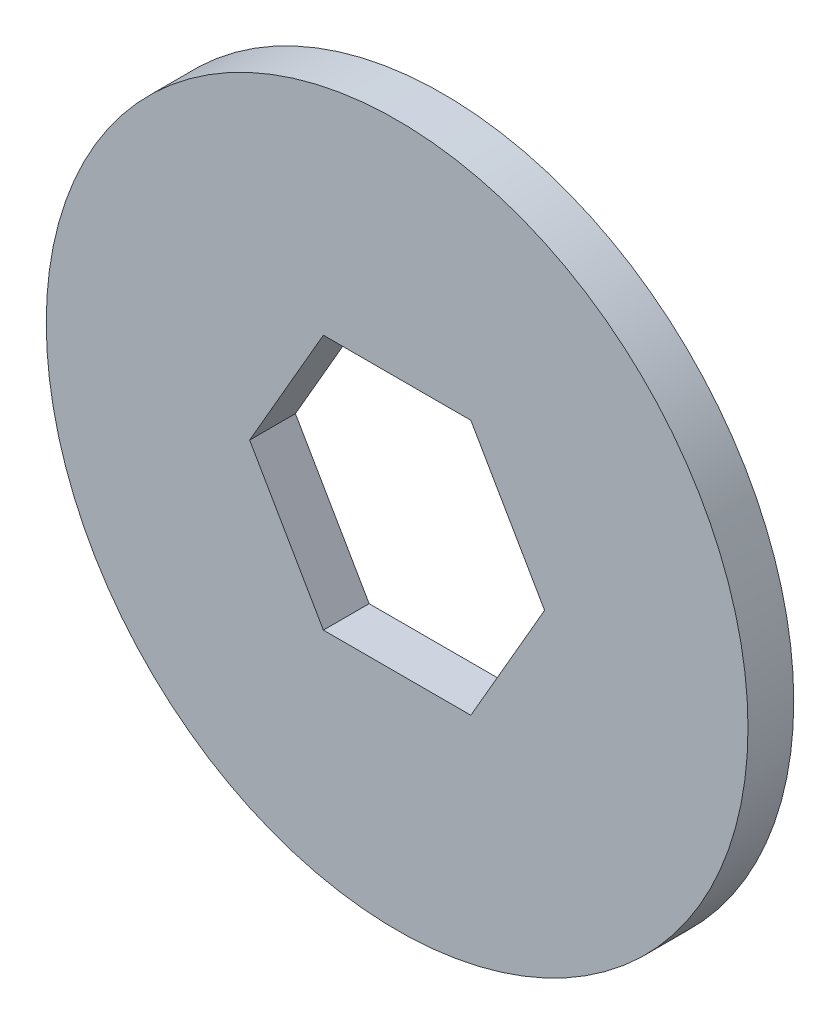
ISO-10303-21;
HEADER;
FILE_DESCRIPTION(('STEP AP214'),'2;1');
FILE_NAME('part.step','',(''),(''),'','','');
FILE_SCHEMA(('AUTOMOTIVE_DESIGN { 1 0 10303 214 1 1 1 1 }'));
ENDSEC;
DATA;
#1=APPLICATION_CONTEXT('core data for automotive mechanical design processes');
#2=APPLICATION_PROTOCOL_DEFINITION('international standard','automotive_design',2000,#1);
#3=PRODUCT_CONTEXT('',#1,'mechanical');
#4=PRODUCT('Part','Part','',(#3));
#5=PRODUCT_RELATED_PRODUCT_CATEGORY('part','',(#4));
#6=PRODUCT_DEFINITION_FORMATION('','',#4);
#7=PRODUCT_DEFINITION_CONTEXT('part definition',#1,'design');
#8=PRODUCT_DEFINITION('design','',#6,#7);
#9=PRODUCT_DEFINITION_SHAPE('','',#8);
#10=(LENGTH_UNIT() NAMED_UNIT(*) SI_UNIT(.MILLI.,.METRE.));
#11=(NAMED_UNIT(*) PLANE_ANGLE_UNIT() SI_UNIT($,.RADIAN.));
#12=(NAMED_UNIT(*) SI_UNIT($,.STERADIAN.) SOLID_ANGLE_UNIT());
#13=UNCERTAINTY_MEASURE_WITH_UNIT(LENGTH_MEASURE(1.E-05),#10,'distance_accuracy_value','');
#14=(GEOMETRIC_REPRESENTATION_CONTEXT(3) GLOBAL_UNCERTAINTY_ASSIGNED_CONTEXT((#13)) GLOBAL_UNIT_ASSIGNED_CONTEXT((#10,
#11,#12)) REPRESENTATION_CONTEXT('',''));
#15=CARTESIAN_POINT('',(0.,0.,0.));
#16=DIRECTION('',(0.,0.,1.));
#17=DIRECTION('',(1.,0.,0.));
#18=AXIS2_PLACEMENT_3D('',#15,#16,#17);
#19=CARTESIAN_POINT('',(0.,0.,2.286));
#20=DIRECTION('',(0.,0.,-1.));
#21=DIRECTION('',(-1.,0.,0.));
#22=AXIS2_PLACEMENT_3D('',#19,#20,#21);
#23=CYLINDRICAL_SURFACE('',#22,17.526);
#24=CARTESIAN_POINT('',(0.,0.,2.286));
#25=DIRECTION('',(0.,0.,1.));
#26=DIRECTION('',(1.,0.,0.));
#27=AXIS2_PLACEMENT_3D('',#24,#25,#26);
#28=CIRCLE('',#27,17.526);
#29=CARTESIAN_POINT('',(17.526,0.,2.286));
#30=VERTEX_POINT('',#29);
#31=EDGE_CURVE('E150',#30,#30,#28,.T.);
#32=ORIENTED_EDGE('',*,*,#31,.F.);
#33=EDGE_LOOP('',(#32));
#34=FACE_BOUND('',#33,.T.);
#35=CARTESIAN_POINT('',(0.,0.,0.));
#36=DIRECTION('',(0.,0.,1.));
#37=DIRECTION('',(1.,0.,0.));
#38=AXIS2_PLACEMENT_3D('',#35,#36,#37);
#39=CIRCLE('',#38,17.526);
#40=CARTESIAN_POINT('',(17.526,0.,0.));
#41=VERTEX_POINT('',#40);
#42=EDGE_CURVE('E135',#41,#41,#39,.T.);
#43=ORIENTED_EDGE('',*,*,#42,.T.);
#44=EDGE_LOOP('',(#43));
#45=FACE_BOUND('',#44,.T.);
#46=ADVANCED_FACE('F45',(#34,#45),#23,.T.);
#47=CARTESIAN_POINT('',(0.,0.,2.286));
#48=DIRECTION('',(0.,0.,1.));
#49=DIRECTION('',(1.,0.,0.));
#50=AXIS2_PLACEMENT_3D('',#47,#48,#49);
#51=PLANE('',#50);
#52=DIRECTION('',(0.5,0.866025403784439,0.));
#53=VECTOR('',#52,1.);
#54=CARTESIAN_POINT('',(-7.366,0.,2.286));
#55=LINE('',#54,#53);
#56=CARTESIAN_POINT('',(-7.366,0.,2.286));
#57=VERTEX_POINT('',#56);
#58=CARTESIAN_POINT('',(-3.683,6.37914312427618,2.286));
#59=VERTEX_POINT('',#58);
#60=EDGE_CURVE('E101',#57,#59,#55,.T.);
#61=ORIENTED_EDGE('',*,*,#60,.T.);
#62=DIRECTION('',(1.,0.,0.));
#63=VECTOR('',#62,1.);
#64=CARTESIAN_POINT('',(-3.683,6.37914312427618,2.286));
#65=LINE('',#64,#63);
#66=CARTESIAN_POINT('',(3.683,6.37914312427618,2.286));
#67=VERTEX_POINT('',#66);
#68=EDGE_CURVE('E109',#59,#67,#65,.T.);
#69=ORIENTED_EDGE('',*,*,#68,.T.);
#70=DIRECTION('',(0.499999999999999,-0.866025403784439,0.));
#71=VECTOR('',#70,1.);
#72=CARTESIAN_POINT('',(3.683,6.37914312427618,2.286));
#73=LINE('',#72,#71);
#74=CARTESIAN_POINT('',(7.366,0.,2.286));
#75=VERTEX_POINT('',#74);
#76=EDGE_CURVE('E60',#67,#75,#73,.T.);
#77=ORIENTED_EDGE('',*,*,#76,.T.);
#78=DIRECTION('',(-0.5,-0.866025403784439,0.));
#79=VECTOR('',#78,1.);
#80=CARTESIAN_POINT('',(7.366,0.,2.286));
#81=LINE('',#80,#79);
#82=CARTESIAN_POINT('',(3.68299999999999,-6.37914312427618,2.286));
#83=VERTEX_POINT('',#82);
#84=EDGE_CURVE('E123',#75,#83,#81,.T.);
#85=ORIENTED_EDGE('',*,*,#84,.T.);
#86=DIRECTION('',(-1.,0.,0.));
#87=VECTOR('',#86,1.);
#88=CARTESIAN_POINT('',(3.68299999999999,-6.37914312427618,2.286));
#89=LINE('',#88,#87);
#90=CARTESIAN_POINT('',(-3.683,-6.37914312427618,2.286));
#91=VERTEX_POINT('',#90);
#92=EDGE_CURVE('E127',#83,#91,#89,.T.);
#93=ORIENTED_EDGE('',*,*,#92,.T.);
#94=DIRECTION('',(-0.5,0.866025403784439,0.));
#95=VECTOR('',#94,1.);
#96=CARTESIAN_POINT('',(-3.683,-6.37914312427618,2.286));
#97=LINE('',#96,#95);
#98=EDGE_CURVE('E106',#91,#57,#97,.T.);
#99=ORIENTED_EDGE('',*,*,#98,.T.);
#100=EDGE_LOOP('',(#61,#69,#77,#85,#93,#99));
#101=FACE_BOUND('',#100,.T.);
#102=ORIENTED_EDGE('',*,*,#31,.T.);
#103=EDGE_LOOP('',(#102));
#104=FACE_BOUND('',#103,.T.);
#105=ADVANCED_FACE('F114',(#101,#104),#51,.T.);
#106=CARTESIAN_POINT('',(0.,0.,0.));
#107=DIRECTION('',(0.,0.,1.));
#108=DIRECTION('',(1.,0.,0.));
#109=AXIS2_PLACEMENT_3D('',#106,#107,#108);
#110=PLANE('',#109);
#111=DIRECTION('',(-1.,0.,0.));
#112=VECTOR('',#111,1.);
#113=CARTESIAN_POINT('',(0.,6.37914312427618,0.));
#114=LINE('',#113,#112);
#115=CARTESIAN_POINT('',(3.683,6.37914312427618,0.));
#116=VERTEX_POINT('',#115);
#117=CARTESIAN_POINT('',(-3.683,6.37914312427618,0.));
#118=VERTEX_POINT('',#117);
#119=EDGE_CURVE('E154',#116,#118,#114,.T.);
#120=ORIENTED_EDGE('',*,*,#119,.T.);
#121=DIRECTION('',(-0.5,-0.866025403784439,0.));
#122=VECTOR('',#121,1.);
#123=CARTESIAN_POINT('',(-5.5245,3.18957156213809,0.));
#124=LINE('',#123,#122);
#125=CARTESIAN_POINT('',(-7.366,0.,0.));
#126=VERTEX_POINT('',#125);
#127=EDGE_CURVE('E11',#118,#126,#124,.T.);
#128=ORIENTED_EDGE('',*,*,#127,.T.);
#129=DIRECTION('',(0.5,-0.866025403784439,0.));
#130=VECTOR('',#129,1.);
#131=CARTESIAN_POINT('',(-5.5245,-3.18957156213809,0.));
#132=LINE('',#131,#130);
#133=CARTESIAN_POINT('',(-3.683,-6.37914312427618,0.));
#134=VERTEX_POINT('',#133);
#135=EDGE_CURVE('E53',#126,#134,#132,.T.);
#136=ORIENTED_EDGE('',*,*,#135,.T.);
#137=DIRECTION('',(1.,0.,0.));
#138=VECTOR('',#137,1.);
#139=CARTESIAN_POINT('',(0.,-6.37914312427618,0.));
#140=LINE('',#139,#138);
#141=CARTESIAN_POINT('',(3.68299999999999,-6.37914312427618,0.));
#142=VERTEX_POINT('',#141);
#143=EDGE_CURVE('E168',#134,#142,#140,.T.);
#144=ORIENTED_EDGE('',*,*,#143,.T.);
#145=DIRECTION('',(0.5,0.866025403784439,0.));
#146=VECTOR('',#145,1.);
#147=CARTESIAN_POINT('',(5.5245,-3.18957156213809,0.));
#148=LINE('',#147,#146);
#149=CARTESIAN_POINT('',(7.366,0.,0.));
#150=VERTEX_POINT('',#149);
#151=EDGE_CURVE('E164',#142,#150,#148,.T.);
#152=ORIENTED_EDGE('',*,*,#151,.T.);
#153=DIRECTION('',(-0.5,0.866025403784439,0.));
#154=VECTOR('',#153,1.);
#155=CARTESIAN_POINT('',(5.5245,3.18957156213808,0.));
#156=LINE('',#155,#154);
#157=EDGE_CURVE('E160',#150,#116,#156,.T.);
#158=ORIENTED_EDGE('',*,*,#157,.T.);
#159=EDGE_LOOP('',(#120,#128,#136,#144,#152,#158));
#160=FACE_BOUND('',#159,.T.);
#161=ORIENTED_EDGE('',*,*,#42,.F.);
#162=EDGE_LOOP('',(#161));
#163=FACE_BOUND('',#162,.T.);
#164=ADVANCED_FACE('F174',(#160,#163),#110,.F.);
#165=CARTESIAN_POINT('',(-7.366,0.,2.286));
#166=DIRECTION('',(-0.866025403784439,0.5,0.));
#167=DIRECTION('',(-0.5,-0.866025403784439,0.));
#168=AXIS2_PLACEMENT_3D('',#165,#166,#167);
#169=PLANE('',#168);
#170=DIRECTION('',(0.,0.,-1.));
#171=VECTOR('',#170,1.);
#172=CARTESIAN_POINT('',(-3.683,6.37914312427618,2.286));
#173=LINE('',#172,#171);
#174=EDGE_CURVE('E68',#59,#118,#173,.T.);
#175=ORIENTED_EDGE('',*,*,#174,.F.);
#176=ORIENTED_EDGE('',*,*,#60,.F.);
#177=DIRECTION('',(0.,0.,-1.));
#178=VECTOR('',#177,1.);
#179=CARTESIAN_POINT('',(-7.366,0.,2.286));
#180=LINE('',#179,#178);
#181=EDGE_CURVE('E132',#57,#126,#180,.T.);
#182=ORIENTED_EDGE('',*,*,#181,.T.);
#183=ORIENTED_EDGE('',*,*,#127,.F.);
#184=EDGE_LOOP('',(#175,#176,#182,#183));
#185=FACE_BOUND('',#184,.T.);
#186=ADVANCED_FACE('F98',(#185),#169,.F.);
#187=CARTESIAN_POINT('',(-3.683,-6.37914312427618,2.286));
#188=DIRECTION('',(-0.866025403784439,-0.5,0.));
#189=DIRECTION('',(0.5,-0.866025403784439,0.));
#190=AXIS2_PLACEMENT_3D('',#187,#188,#189);
#191=PLANE('',#190);
#192=ORIENTED_EDGE('',*,*,#181,.F.);
#193=ORIENTED_EDGE('',*,*,#98,.F.);
#194=DIRECTION('',(0.,0.,-1.));
#195=VECTOR('',#194,1.);
#196=CARTESIAN_POINT('',(-3.683,-6.37914312427618,2.286));
#197=LINE('',#196,#195);
#198=EDGE_CURVE('E136',#91,#134,#197,.T.);
#199=ORIENTED_EDGE('',*,*,#198,.T.);
#200=ORIENTED_EDGE('',*,*,#135,.F.);
#201=EDGE_LOOP('',(#192,#193,#199,#200));
#202=FACE_BOUND('',#201,.T.);
#203=ADVANCED_FACE('F177',(#202),#191,.F.);
#204=CARTESIAN_POINT('',(3.68299999999999,-6.37914312427618,2.286));
#205=DIRECTION('',(0.,-1.,0.));
#206=DIRECTION('',(0.,0.,-1.));
#207=AXIS2_PLACEMENT_3D('',#204,#205,#206);
#208=PLANE('',#207);
#209=ORIENTED_EDGE('',*,*,#198,.F.);
#210=ORIENTED_EDGE('',*,*,#92,.F.);
#211=DIRECTION('',(0.,0.,-1.));
#212=VECTOR('',#211,1.);
#213=CARTESIAN_POINT('',(3.68299999999999,-6.37914312427618,2.286));
#214=LINE('',#213,#212);
#215=EDGE_CURVE('E140',#83,#142,#214,.T.);
#216=ORIENTED_EDGE('',*,*,#215,.T.);
#217=ORIENTED_EDGE('',*,*,#143,.F.);
#218=EDGE_LOOP('',(#209,#210,#216,#217));
#219=FACE_BOUND('',#218,.T.);
#220=ADVANCED_FACE('F180',(#219),#208,.F.);
#221=CARTESIAN_POINT('',(7.366,0.,2.286));
#222=DIRECTION('',(0.866025403784439,-0.5,0.));
#223=DIRECTION('',(0.5,0.866025403784439,0.));
#224=AXIS2_PLACEMENT_3D('',#221,#222,#223);
#225=PLANE('',#224);
#226=ORIENTED_EDGE('',*,*,#215,.F.);
#227=ORIENTED_EDGE('',*,*,#84,.F.);
#228=DIRECTION('',(0.,0.,-1.));
#229=VECTOR('',#228,1.);
#230=CARTESIAN_POINT('',(7.366,0.,2.286));
#231=LINE('',#230,#229);
#232=EDGE_CURVE('E144',#75,#150,#231,.T.);
#233=ORIENTED_EDGE('',*,*,#232,.T.);
#234=ORIENTED_EDGE('',*,*,#151,.F.);
#235=EDGE_LOOP('',(#226,#227,#233,#234));
#236=FACE_BOUND('',#235,.T.);
#237=ADVANCED_FACE('F183',(#236),#225,.F.);
#238=CARTESIAN_POINT('',(3.683,6.37914312427618,2.286));
#239=DIRECTION('',(0.866025403784439,0.5,0.));
#240=DIRECTION('',(-0.5,0.866025403784439,0.));
#241=AXIS2_PLACEMENT_3D('',#238,#239,#240);
#242=PLANE('',#241);
#243=ORIENTED_EDGE('',*,*,#232,.F.);
#244=ORIENTED_EDGE('',*,*,#76,.F.);
#245=DIRECTION('',(0.,0.,-1.));
#246=VECTOR('',#245,1.);
#247=CARTESIAN_POINT('',(3.683,6.37914312427618,2.286));
#248=LINE('',#247,#246);
#249=EDGE_CURVE('E105',#67,#116,#248,.T.);
#250=ORIENTED_EDGE('',*,*,#249,.T.);
#251=ORIENTED_EDGE('',*,*,#157,.F.);
#252=EDGE_LOOP('',(#243,#244,#250,#251));
#253=FACE_BOUND('',#252,.T.);
#254=ADVANCED_FACE('F184',(#253),#242,.F.);
#255=CARTESIAN_POINT('',(-3.683,6.37914312427618,2.286));
#256=DIRECTION('',(0.,1.,0.));
#257=DIRECTION('',(-1.,0.,0.));
#258=AXIS2_PLACEMENT_3D('',#255,#256,#257);
#259=PLANE('',#258);
#260=ORIENTED_EDGE('',*,*,#249,.F.);
#261=ORIENTED_EDGE('',*,*,#68,.F.);
#262=ORIENTED_EDGE('',*,*,#174,.T.);
#263=ORIENTED_EDGE('',*,*,#119,.F.);
#264=EDGE_LOOP('',(#260,#261,#262,#263));
#265=FACE_BOUND('',#264,.T.);
#266=ADVANCED_FACE('F110',(#265),#259,.F.);
#267=CLOSED_SHELL('',(#46,#105,#164,#186,#203,#220,#237,#254,#266));
#268=MANIFOLD_SOLID_BREP('B2',#267);
#269=ADVANCED_BREP_SHAPE_REPRESENTATION('',(#18,#268),#14);
#270=SHAPE_DEFINITION_REPRESENTATION(#9,#269);
ENDSEC;
END-ISO-10303-21;
